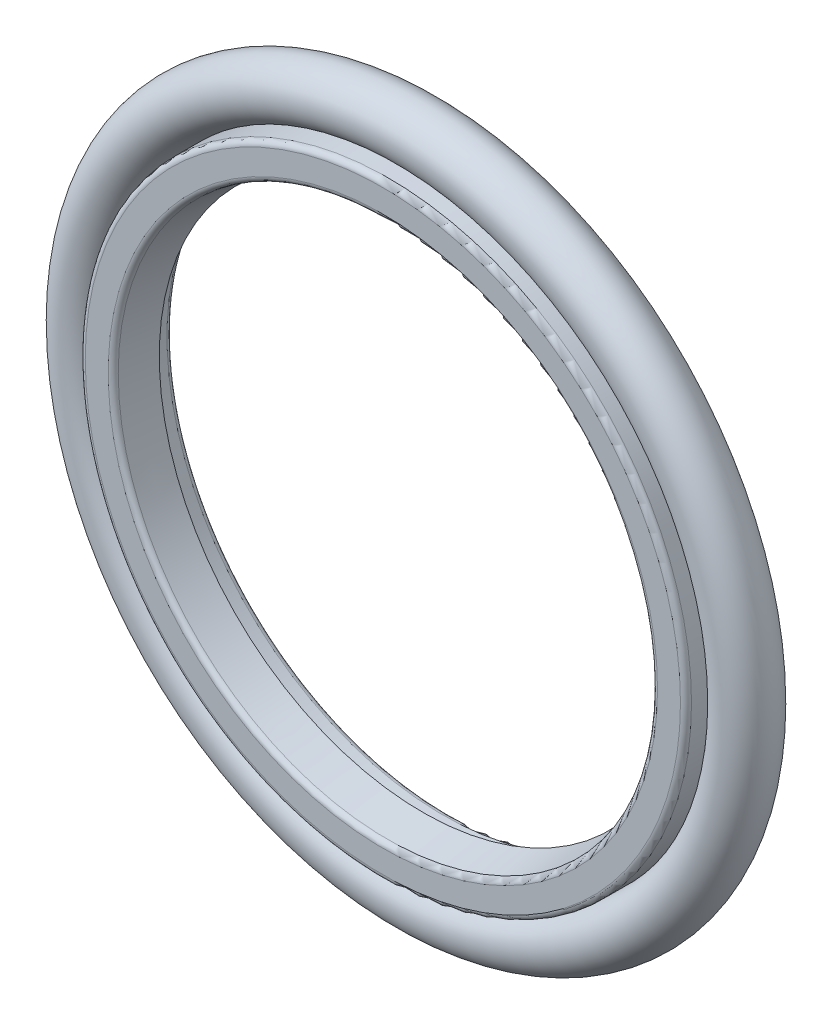
ISO-10303-21;
HEADER;
FILE_DESCRIPTION(('STEP AP214'),'2;1');
FILE_NAME('part.step','',(''),(''),'','','');
FILE_SCHEMA(('AUTOMOTIVE_DESIGN { 1 0 10303 214 1 1 1 1 }'));
ENDSEC;
DATA;
#1=APPLICATION_CONTEXT('core data for automotive mechanical design processes');
#2=APPLICATION_PROTOCOL_DEFINITION('international standard','automotive_design',2000,#1);
#3=PRODUCT_CONTEXT('',#1,'mechanical');
#4=PRODUCT('Part','Part','',(#3));
#5=PRODUCT_RELATED_PRODUCT_CATEGORY('part','',(#4));
#6=PRODUCT_DEFINITION_FORMATION('','',#4);
#7=PRODUCT_DEFINITION_CONTEXT('part definition',#1,'design');
#8=PRODUCT_DEFINITION('design','',#6,#7);
#9=PRODUCT_DEFINITION_SHAPE('','',#8);
#10=(LENGTH_UNIT() NAMED_UNIT(*) SI_UNIT(.MILLI.,.METRE.));
#11=(NAMED_UNIT(*) PLANE_ANGLE_UNIT() SI_UNIT($,.RADIAN.));
#12=(NAMED_UNIT(*) SI_UNIT($,.STERADIAN.) SOLID_ANGLE_UNIT());
#13=UNCERTAINTY_MEASURE_WITH_UNIT(LENGTH_MEASURE(1.E-05),#10,'distance_accuracy_value','');
#14=(GEOMETRIC_REPRESENTATION_CONTEXT(3) GLOBAL_UNCERTAINTY_ASSIGNED_CONTEXT((#13)) GLOBAL_UNIT_ASSIGNED_CONTEXT((#10,
#11,#12)) REPRESENTATION_CONTEXT('',''));
#15=CARTESIAN_POINT('',(0.,0.,0.));
#16=DIRECTION('',(0.,0.,1.));
#17=DIRECTION('',(1.,0.,0.));
#18=AXIS2_PLACEMENT_3D('',#15,#16,#17);
#19=CARTESIAN_POINT('',(0.,0.,-1.5));
#20=DIRECTION('',(0.,0.,1.));
#21=DIRECTION('',(1.,0.,0.));
#22=AXIS2_PLACEMENT_3D('',#19,#20,#21);
#23=TOROIDAL_SURFACE('',#22,14.97,1.25);
#24=CARTESIAN_POINT('',(16.22,0.,-1.5));
#25=VERTEX_POINT('',#24);
#26=VERTEX_LOOP('',#25);
#27=FACE_BOUND('',#26,.T.);
#28=ADVANCED_FACE('F49',(#27),#23,.T.);
#29=CLOSED_SHELL('',(#28));
#30=MANIFOLD_SOLID_BREP('B2',#29);
#31=CARTESIAN_POINT('',(0.,0.,-0.25));
#32=DIRECTION('',(0.,0.,1.));
#33=DIRECTION('',(1.,0.,0.));
#34=AXIS2_PLACEMENT_3D('',#31,#32,#33);
#35=TOROIDAL_SURFACE('',#34,12.4317817720958,0.25);
#36=CARTESIAN_POINT('',(0.,0.,-0.208900253173661));
#37=DIRECTION('',(0.,0.,1.));
#38=DIRECTION('',(1.,0.,0.));
#39=AXIS2_PLACEMENT_3D('',#36,#37,#38);
#40=CIRCLE('',#39,12.1851832911377);
#41=CARTESIAN_POINT('',(12.1851832911377,0.,-0.208900253173661));
#42=VERTEX_POINT('',#41);
#43=EDGE_CURVE('E48',#42,#42,#40,.T.);
#44=ORIENTED_EDGE('',*,*,#43,.F.);
#45=EDGE_LOOP('',(#44));
#46=FACE_BOUND('',#45,.T.);
#47=CARTESIAN_POINT('',(0.,0.,0.));
#48=DIRECTION('',(0.,0.,1.));
#49=DIRECTION('',(1.,0.,0.));
#50=AXIS2_PLACEMENT_3D('',#47,#48,#49);
#51=CIRCLE('',#50,12.4317817720958);
#52=CARTESIAN_POINT('',(12.4317817720958,0.,0.));
#53=VERTEX_POINT('',#52);
#54=EDGE_CURVE('E100',#53,#53,#51,.T.);
#55=ORIENTED_EDGE('',*,*,#54,.T.);
#56=EDGE_LOOP('',(#55));
#57=FACE_BOUND('',#56,.T.);
#58=ADVANCED_FACE('F66',(#46,#57),#35,.T.);
#59=CARTESIAN_POINT('',(0.,0.,-0.208900253173661));
#60=DIRECTION('',(0.,0.,1.));
#61=DIRECTION('',(1.,0.,0.));
#62=AXIS2_PLACEMENT_3D('',#59,#60,#61);
#63=CONICAL_SURFACE('',#62,12.1851832911377,0.165148677414627);
#64=CARTESIAN_POINT('',(0.,0.,-1.8));
#65=DIRECTION('',(0.,0.,1.));
#66=DIRECTION('',(1.,0.,0.));
#67=AXIS2_PLACEMENT_3D('',#64,#65,#66);
#68=CIRCLE('',#67,11.92);
#69=CARTESIAN_POINT('',(11.92,0.,-1.8));
#70=VERTEX_POINT('',#69);
#71=EDGE_CURVE('E72',#70,#70,#68,.T.);
#72=ORIENTED_EDGE('',*,*,#71,.F.);
#73=EDGE_LOOP('',(#72));
#74=FACE_BOUND('',#73,.T.);
#75=ORIENTED_EDGE('',*,*,#43,.T.);
#76=EDGE_LOOP('',(#75));
#77=FACE_BOUND('',#76,.T.);
#78=ADVANCED_FACE('F149',(#74,#77),#63,.F.);
#79=CARTESIAN_POINT('',(0.,0.,-1.8));
#80=DIRECTION('',(0.,0.,-1.));
#81=DIRECTION('',(-1.,0.,0.));
#82=AXIS2_PLACEMENT_3D('',#79,#80,#81);
#83=CONICAL_SURFACE('',#82,11.92,0.982793723247329);
#84=CARTESIAN_POINT('',(0.,0.,-2.2));
#85=DIRECTION('',(0.,0.,1.));
#86=DIRECTION('',(1.,0.,0.));
#87=AXIS2_PLACEMENT_3D('',#84,#85,#86);
#88=CIRCLE('',#87,12.52);
#89=CARTESIAN_POINT('',(12.52,0.,-2.2));
#90=VERTEX_POINT('',#89);
#91=EDGE_CURVE('E76',#90,#90,#88,.T.);
#92=ORIENTED_EDGE('',*,*,#91,.F.);
#93=EDGE_LOOP('',(#92));
#94=FACE_BOUND('',#93,.T.);
#95=ORIENTED_EDGE('',*,*,#71,.T.);
#96=EDGE_LOOP('',(#95));
#97=FACE_BOUND('',#96,.T.);
#98=ADVANCED_FACE('F144',(#94,#97),#83,.F.);
#99=CARTESIAN_POINT('',(0.,0.,0.));
#100=DIRECTION('',(0.,0.,1.));
#101=DIRECTION('',(1.,0.,0.));
#102=AXIS2_PLACEMENT_3D('',#99,#100,#101);
#103=CYLINDRICAL_SURFACE('',#102,12.52);
#104=CARTESIAN_POINT('',(0.,0.,-2.75));
#105=DIRECTION('',(0.,0.,1.));
#106=DIRECTION('',(1.,0.,0.));
#107=AXIS2_PLACEMENT_3D('',#104,#105,#106);
#108=CIRCLE('',#107,12.52);
#109=CARTESIAN_POINT('',(12.52,0.,-2.75));
#110=VERTEX_POINT('',#109);
#111=EDGE_CURVE('E80',#110,#110,#108,.T.);
#112=ORIENTED_EDGE('',*,*,#111,.F.);
#113=EDGE_LOOP('',(#112));
#114=FACE_BOUND('',#113,.T.);
#115=ORIENTED_EDGE('',*,*,#91,.T.);
#116=EDGE_LOOP('',(#115));
#117=FACE_BOUND('',#116,.T.);
#118=ADVANCED_FACE('F138',(#114,#117),#103,.F.);
#119=CARTESIAN_POINT('',(0.,0.,-2.75));
#120=DIRECTION('',(0.,0.,1.));
#121=DIRECTION('',(1.,0.,0.));
#122=AXIS2_PLACEMENT_3D('',#119,#120,#121);
#123=TOROIDAL_SURFACE('',#122,12.77,0.25);
#124=CARTESIAN_POINT('',(0.,0.,-3.));
#125=DIRECTION('',(0.,0.,1.));
#126=DIRECTION('',(1.,0.,0.));
#127=AXIS2_PLACEMENT_3D('',#124,#125,#126);
#128=CIRCLE('',#127,12.77);
#129=CARTESIAN_POINT('',(12.77,0.,-3.));
#130=VERTEX_POINT('',#129);
#131=EDGE_CURVE('E85',#130,#130,#128,.T.);
#132=ORIENTED_EDGE('',*,*,#131,.F.);
#133=EDGE_LOOP('',(#132));
#134=FACE_BOUND('',#133,.T.);
#135=ORIENTED_EDGE('',*,*,#111,.T.);
#136=EDGE_LOOP('',(#135));
#137=FACE_BOUND('',#136,.T.);
#138=ADVANCED_FACE('F132',(#134,#137),#123,.T.);
#139=CARTESIAN_POINT('',(0.,13.47,-3.));
#140=DIRECTION('',(0.,0.,1.));
#141=DIRECTION('',(1.,0.,0.));
#142=AXIS2_PLACEMENT_3D('',#139,#140,#141);
#143=PLANE('',#142);
#144=CARTESIAN_POINT('',(0.,0.,-3.));
#145=DIRECTION('',(0.,0.,1.));
#146=DIRECTION('',(1.,0.,0.));
#147=AXIS2_PLACEMENT_3D('',#144,#145,#146);
#148=CIRCLE('',#147,13.47);
#149=CARTESIAN_POINT('',(13.47,0.,-3.));
#150=VERTEX_POINT('',#149);
#151=EDGE_CURVE('E88',#150,#150,#148,.T.);
#152=ORIENTED_EDGE('',*,*,#151,.F.);
#153=EDGE_LOOP('',(#152));
#154=FACE_BOUND('',#153,.T.);
#155=ORIENTED_EDGE('',*,*,#131,.T.);
#156=EDGE_LOOP('',(#155));
#157=FACE_BOUND('',#156,.T.);
#158=ADVANCED_FACE('F126',(#154,#157),#143,.F.);
#159=CARTESIAN_POINT('',(0.,0.,-2.75));
#160=DIRECTION('',(0.,0.,1.));
#161=DIRECTION('',(1.,0.,0.));
#162=AXIS2_PLACEMENT_3D('',#159,#160,#161);
#163=TOROIDAL_SURFACE('',#162,13.47,0.25);
#164=CARTESIAN_POINT('',(0.,0.,-2.75));
#165=DIRECTION('',(0.,0.,1.));
#166=DIRECTION('',(1.,0.,0.));
#167=AXIS2_PLACEMENT_3D('',#164,#165,#166);
#168=CIRCLE('',#167,13.72);
#169=CARTESIAN_POINT('',(13.72,0.,-2.75));
#170=VERTEX_POINT('',#169);
#171=EDGE_CURVE('E91',#170,#170,#168,.T.);
#172=ORIENTED_EDGE('',*,*,#171,.F.);
#173=EDGE_LOOP('',(#172));
#174=FACE_BOUND('',#173,.T.);
#175=ORIENTED_EDGE('',*,*,#151,.T.);
#176=EDGE_LOOP('',(#175));
#177=FACE_BOUND('',#176,.T.);
#178=ADVANCED_FACE('F120',(#174,#177),#163,.T.);
#179=CARTESIAN_POINT('',(0.,0.,0.));
#180=DIRECTION('',(0.,0.,1.));
#181=DIRECTION('',(1.,0.,0.));
#182=AXIS2_PLACEMENT_3D('',#179,#180,#181);
#183=CYLINDRICAL_SURFACE('',#182,13.72);
#184=CARTESIAN_POINT('',(0.,0.,-0.25));
#185=DIRECTION('',(0.,0.,1.));
#186=DIRECTION('',(1.,0.,0.));
#187=AXIS2_PLACEMENT_3D('',#184,#185,#186);
#188=CIRCLE('',#187,13.72);
#189=CARTESIAN_POINT('',(13.72,0.,-0.25));
#190=VERTEX_POINT('',#189);
#191=EDGE_CURVE('E94',#190,#190,#188,.T.);
#192=ORIENTED_EDGE('',*,*,#191,.F.);
#193=EDGE_LOOP('',(#192));
#194=FACE_BOUND('',#193,.T.);
#195=ORIENTED_EDGE('',*,*,#171,.T.);
#196=EDGE_LOOP('',(#195));
#197=FACE_BOUND('',#196,.T.);
#198=ADVANCED_FACE('F114',(#194,#197),#183,.T.);
#199=CARTESIAN_POINT('',(0.,0.,-0.25));
#200=DIRECTION('',(0.,0.,1.));
#201=DIRECTION('',(1.,0.,0.));
#202=AXIS2_PLACEMENT_3D('',#199,#200,#201);
#203=TOROIDAL_SURFACE('',#202,13.47,0.25);
#204=CARTESIAN_POINT('',(0.,0.,0.));
#205=DIRECTION('',(0.,0.,1.));
#206=DIRECTION('',(1.,0.,0.));
#207=AXIS2_PLACEMENT_3D('',#204,#205,#206);
#208=CIRCLE('',#207,13.47);
#209=CARTESIAN_POINT('',(13.47,0.,0.));
#210=VERTEX_POINT('',#209);
#211=EDGE_CURVE('E97',#210,#210,#208,.T.);
#212=ORIENTED_EDGE('',*,*,#211,.F.);
#213=EDGE_LOOP('',(#212));
#214=FACE_BOUND('',#213,.T.);
#215=ORIENTED_EDGE('',*,*,#191,.T.);
#216=EDGE_LOOP('',(#215));
#217=FACE_BOUND('',#216,.T.);
#218=ADVANCED_FACE('F108',(#214,#217),#203,.T.);
#219=CARTESIAN_POINT('',(0.,13.47,0.));
#220=DIRECTION('',(0.,0.,-1.));
#221=DIRECTION('',(-1.,0.,0.));
#222=AXIS2_PLACEMENT_3D('',#219,#220,#221);
#223=PLANE('',#222);
#224=ORIENTED_EDGE('',*,*,#54,.F.);
#225=EDGE_LOOP('',(#224));
#226=FACE_BOUND('',#225,.T.);
#227=ORIENTED_EDGE('',*,*,#211,.T.);
#228=EDGE_LOOP('',(#227));
#229=FACE_BOUND('',#228,.T.);
#230=ADVANCED_FACE('F105',(#226,#229),#223,.F.);
#231=CLOSED_SHELL('',(#58,#78,#98,#118,#138,#158,#178,#198,#218,#230));
#232=MANIFOLD_SOLID_BREP('B6',#231);
#233=ADVANCED_BREP_SHAPE_REPRESENTATION('',(#18,#30,#232),#14);
#234=SHAPE_DEFINITION_REPRESENTATION(#9,#233);
ENDSEC;
END-ISO-10303-21;
